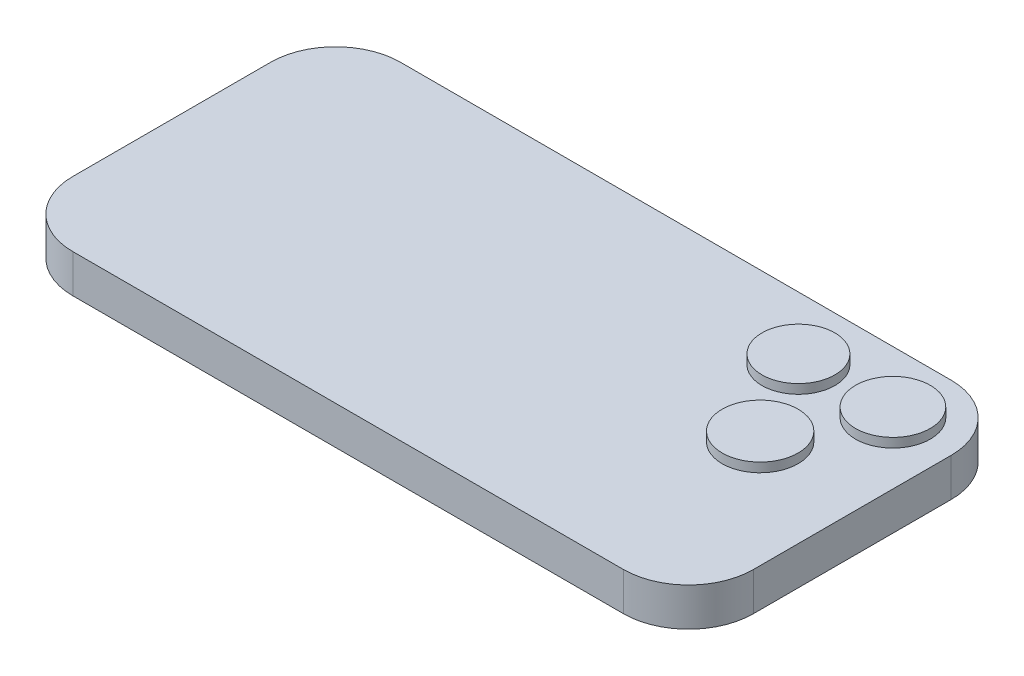
ISO-10303-21;
HEADER;
FILE_DESCRIPTION(('STEP AP214'),'2;1');
FILE_NAME('part.step','',(''),(''),'','','');
FILE_SCHEMA(('AUTOMOTIVE_DESIGN { 1 0 10303 214 1 1 1 1 }'));
ENDSEC;
DATA;
#1=APPLICATION_CONTEXT('core data for automotive mechanical design processes');
#2=APPLICATION_PROTOCOL_DEFINITION('international standard','automotive_design',2000,#1);
#3=PRODUCT_CONTEXT('',#1,'mechanical');
#4=PRODUCT('Part','Part','',(#3));
#5=PRODUCT_RELATED_PRODUCT_CATEGORY('part','',(#4));
#6=PRODUCT_DEFINITION_FORMATION('','',#4);
#7=PRODUCT_DEFINITION_CONTEXT('part definition',#1,'design');
#8=PRODUCT_DEFINITION('design','',#6,#7);
#9=PRODUCT_DEFINITION_SHAPE('','',#8);
#10=(LENGTH_UNIT() NAMED_UNIT(*) SI_UNIT(.MILLI.,.METRE.));
#11=(NAMED_UNIT(*) PLANE_ANGLE_UNIT() SI_UNIT($,.RADIAN.));
#12=(NAMED_UNIT(*) SI_UNIT($,.STERADIAN.) SOLID_ANGLE_UNIT());
#13=UNCERTAINTY_MEASURE_WITH_UNIT(LENGTH_MEASURE(1.E-05),#10,'distance_accuracy_value','');
#14=(GEOMETRIC_REPRESENTATION_CONTEXT(3) GLOBAL_UNCERTAINTY_ASSIGNED_CONTEXT((#13)) GLOBAL_UNIT_ASSIGNED_CONTEXT((#10,
#11,#12)) REPRESENTATION_CONTEXT('',''));
#15=CARTESIAN_POINT('',(0.,0.,0.));
#16=DIRECTION('',(0.,0.,1.));
#17=DIRECTION('',(1.,0.,0.));
#18=AXIS2_PLACEMENT_3D('',#15,#16,#17);
#19=CARTESIAN_POINT('',(-73.3,8.25,35.3));
#20=DIRECTION('',(1.,0.,0.));
#21=DIRECTION('',(0.,0.,-1.));
#22=AXIS2_PLACEMENT_3D('',#19,#20,#21);
#23=PLANE('',#22);
#24=DIRECTION('',(0.,0.,1.));
#25=VECTOR('',#24,1.);
#26=CARTESIAN_POINT('',(-73.3,8.25,35.3));
#27=LINE('',#26,#25);
#28=CARTESIAN_POINT('',(-73.3,8.25,-21.3));
#29=VERTEX_POINT('',#28);
#30=CARTESIAN_POINT('',(-73.3,8.25,21.3));
#31=VERTEX_POINT('',#30);
#32=EDGE_CURVE('E135',#29,#31,#27,.T.);
#33=ORIENTED_EDGE('',*,*,#32,.F.);
#34=DIRECTION('',(0.,-1.,0.));
#35=VECTOR('',#34,1.);
#36=CARTESIAN_POINT('',(-73.3,8.25,-21.3));
#37=LINE('',#36,#35);
#38=CARTESIAN_POINT('',(-73.3,0.,-21.3));
#39=VERTEX_POINT('',#38);
#40=EDGE_CURVE('E11',#29,#39,#37,.T.);
#41=ORIENTED_EDGE('',*,*,#40,.T.);
#42=DIRECTION('',(0.,0.,1.));
#43=VECTOR('',#42,1.);
#44=CARTESIAN_POINT('',(-73.3,0.,35.3));
#45=LINE('',#44,#43);
#46=CARTESIAN_POINT('',(-73.3,0.,21.3));
#47=VERTEX_POINT('',#46);
#48=EDGE_CURVE('E166',#39,#47,#45,.T.);
#49=ORIENTED_EDGE('',*,*,#48,.T.);
#50=DIRECTION('',(0.,-1.,0.));
#51=VECTOR('',#50,1.);
#52=CARTESIAN_POINT('',(-73.3,8.25,21.3));
#53=LINE('',#52,#51);
#54=EDGE_CURVE('E49',#47,#31,#53,.F.);
#55=ORIENTED_EDGE('',*,*,#54,.T.);
#56=EDGE_LOOP('',(#33,#41,#49,#55));
#57=FACE_BOUND('',#56,.T.);
#58=ADVANCED_FACE('F41',(#57),#23,.F.);
#59=CARTESIAN_POINT('',(73.3,8.25,35.3));
#60=DIRECTION('',(0.,0.,-1.));
#61=DIRECTION('',(-1.,0.,0.));
#62=AXIS2_PLACEMENT_3D('',#59,#60,#61);
#63=PLANE('',#62);
#64=DIRECTION('',(1.,0.,0.));
#65=VECTOR('',#64,1.);
#66=CARTESIAN_POINT('',(73.3,0.,35.3));
#67=LINE('',#66,#65);
#68=CARTESIAN_POINT('',(-59.3,0.,35.3));
#69=VERTEX_POINT('',#68);
#70=CARTESIAN_POINT('',(59.3,0.,35.3));
#71=VERTEX_POINT('',#70);
#72=EDGE_CURVE('E140',#69,#71,#67,.T.);
#73=ORIENTED_EDGE('',*,*,#72,.T.);
#74=DIRECTION('',(0.,-1.,0.));
#75=VECTOR('',#74,1.);
#76=CARTESIAN_POINT('',(59.3,8.25,35.3));
#77=LINE('',#76,#75);
#78=CARTESIAN_POINT('',(59.3,8.25,35.3));
#79=VERTEX_POINT('',#78);
#80=EDGE_CURVE('E56',#71,#79,#77,.F.);
#81=ORIENTED_EDGE('',*,*,#80,.T.);
#82=DIRECTION('',(1.,0.,0.));
#83=VECTOR('',#82,1.);
#84=CARTESIAN_POINT('',(73.3,8.25,35.3));
#85=LINE('',#84,#83);
#86=CARTESIAN_POINT('',(-59.3,8.25,35.3));
#87=VERTEX_POINT('',#86);
#88=EDGE_CURVE('E138',#87,#79,#85,.T.);
#89=ORIENTED_EDGE('',*,*,#88,.F.);
#90=DIRECTION('',(0.,-1.,0.));
#91=VECTOR('',#90,1.);
#92=CARTESIAN_POINT('',(-59.3,8.25,35.3));
#93=LINE('',#92,#91);
#94=EDGE_CURVE('E158',#87,#69,#93,.T.);
#95=ORIENTED_EDGE('',*,*,#94,.T.);
#96=EDGE_LOOP('',(#73,#81,#89,#95));
#97=FACE_BOUND('',#96,.T.);
#98=ADVANCED_FACE('F173',(#97),#63,.F.);
#99=CARTESIAN_POINT('',(73.3,8.25,35.3));
#100=DIRECTION('',(-1.,0.,0.));
#101=DIRECTION('',(0.,0.,1.));
#102=AXIS2_PLACEMENT_3D('',#99,#100,#101);
#103=PLANE('',#102);
#104=DIRECTION('',(0.,0.,-1.));
#105=VECTOR('',#104,1.);
#106=CARTESIAN_POINT('',(73.3,0.,35.3));
#107=LINE('',#106,#105);
#108=CARTESIAN_POINT('',(73.3,0.,21.3));
#109=VERTEX_POINT('',#108);
#110=CARTESIAN_POINT('',(73.3,0.,-21.3));
#111=VERTEX_POINT('',#110);
#112=EDGE_CURVE('E136',#109,#111,#107,.T.);
#113=ORIENTED_EDGE('',*,*,#112,.T.);
#114=DIRECTION('',(0.,-1.,0.));
#115=VECTOR('',#114,1.);
#116=CARTESIAN_POINT('',(73.3,8.25,-21.3));
#117=LINE('',#116,#115);
#118=CARTESIAN_POINT('',(73.3,8.25,-21.3));
#119=VERTEX_POINT('',#118);
#120=EDGE_CURVE('E113',#111,#119,#117,.F.);
#121=ORIENTED_EDGE('',*,*,#120,.T.);
#122=DIRECTION('',(0.,0.,-1.));
#123=VECTOR('',#122,1.);
#124=CARTESIAN_POINT('',(73.3,8.25,35.3));
#125=LINE('',#124,#123);
#126=CARTESIAN_POINT('',(73.3,8.25,21.3));
#127=VERTEX_POINT('',#126);
#128=EDGE_CURVE('E178',#127,#119,#125,.T.);
#129=ORIENTED_EDGE('',*,*,#128,.F.);
#130=DIRECTION('',(0.,-1.,0.));
#131=VECTOR('',#130,1.);
#132=CARTESIAN_POINT('',(73.3,8.25,21.3));
#133=LINE('',#132,#131);
#134=EDGE_CURVE('E118',#127,#109,#133,.T.);
#135=ORIENTED_EDGE('',*,*,#134,.T.);
#136=EDGE_LOOP('',(#113,#121,#129,#135));
#137=FACE_BOUND('',#136,.T.);
#138=ADVANCED_FACE('F234',(#137),#103,.F.);
#139=CARTESIAN_POINT('',(73.3,8.25,-35.3));
#140=DIRECTION('',(0.,0.,1.));
#141=DIRECTION('',(1.,0.,0.));
#142=AXIS2_PLACEMENT_3D('',#139,#140,#141);
#143=PLANE('',#142);
#144=DIRECTION('',(-1.,0.,0.));
#145=VECTOR('',#144,1.);
#146=CARTESIAN_POINT('',(73.3,8.25,-35.3));
#147=LINE('',#146,#145);
#148=CARTESIAN_POINT('',(59.3,8.25,-35.3));
#149=VERTEX_POINT('',#148);
#150=CARTESIAN_POINT('',(-59.3,8.25,-35.3));
#151=VERTEX_POINT('',#150);
#152=EDGE_CURVE('E128',#149,#151,#147,.T.);
#153=ORIENTED_EDGE('',*,*,#152,.F.);
#154=DIRECTION('',(0.,-1.,0.));
#155=VECTOR('',#154,1.);
#156=CARTESIAN_POINT('',(59.3,8.25,-35.3));
#157=LINE('',#156,#155);
#158=CARTESIAN_POINT('',(59.3,0.,-35.3));
#159=VERTEX_POINT('',#158);
#160=EDGE_CURVE('E112',#149,#159,#157,.T.);
#161=ORIENTED_EDGE('',*,*,#160,.T.);
#162=DIRECTION('',(-1.,0.,0.));
#163=VECTOR('',#162,1.);
#164=CARTESIAN_POINT('',(73.3,0.,-35.3));
#165=LINE('',#164,#163);
#166=CARTESIAN_POINT('',(-59.3,0.,-35.3));
#167=VERTEX_POINT('',#166);
#168=EDGE_CURVE('E125',#159,#167,#165,.T.);
#169=ORIENTED_EDGE('',*,*,#168,.T.);
#170=DIRECTION('',(0.,-1.,0.));
#171=VECTOR('',#170,1.);
#172=CARTESIAN_POINT('',(-59.3,8.25,-35.3));
#173=LINE('',#172,#171);
#174=EDGE_CURVE('E130',#167,#151,#173,.F.);
#175=ORIENTED_EDGE('',*,*,#174,.T.);
#176=EDGE_LOOP('',(#153,#161,#169,#175));
#177=FACE_BOUND('',#176,.T.);
#178=ADVANCED_FACE('F124',(#177),#143,.F.);
#179=CARTESIAN_POINT('',(0.,8.25,0.));
#180=DIRECTION('',(0.,1.,0.));
#181=DIRECTION('',(0.,0.,1.));
#182=AXIS2_PLACEMENT_3D('',#179,#180,#181);
#183=PLANE('',#182);
#184=CARTESIAN_POINT('',(50.2107638034083,8.25,-3.23733529940573));
#185=DIRECTION('',(0.,1.,0.));
#186=DIRECTION('',(0.,0.,1.));
#187=AXIS2_PLACEMENT_3D('',#184,#185,#186);
#188=CIRCLE('',#187,8.17811363531827);
#189=CARTESIAN_POINT('',(50.2107638034083,8.25,4.94077833591254));
#190=VERTEX_POINT('',#189);
#191=EDGE_CURVE('E193',#190,#190,#188,.T.);
#192=ORIENTED_EDGE('',*,*,#191,.F.);
#193=EDGE_LOOP('',(#192));
#194=FACE_BOUND('',#193,.T.);
#195=CARTESIAN_POINT('',(59.9908504431275,8.25,-22.0502867989051));
#196=DIRECTION('',(0.,1.,0.));
#197=DIRECTION('',(0.,0.,1.));
#198=AXIS2_PLACEMENT_3D('',#195,#196,#197);
#199=CIRCLE('',#198,8.04981965190935);
#200=CARTESIAN_POINT('',(59.9908504431275,8.25,-14.0004671469957));
#201=VERTEX_POINT('',#200);
#202=EDGE_CURVE('E187',#201,#201,#199,.T.);
#203=ORIENTED_EDGE('',*,*,#202,.F.);
#204=EDGE_LOOP('',(#203));
#205=FACE_BOUND('',#204,.T.);
#206=CARTESIAN_POINT('',(39.929810702018,8.25,-21.7600441928197));
#207=DIRECTION('',(0.,1.,0.));
#208=DIRECTION('',(0.,0.,1.));
#209=AXIS2_PLACEMENT_3D('',#206,#207,#208);
#210=CIRCLE('',#209,7.84413539981561);
#211=CARTESIAN_POINT('',(39.929810702018,8.25,-13.9159087930041));
#212=VERTEX_POINT('',#211);
#213=EDGE_CURVE('E181',#212,#212,#210,.T.);
#214=ORIENTED_EDGE('',*,*,#213,.F.);
#215=EDGE_LOOP('',(#214));
#216=FACE_BOUND('',#215,.T.);
#217=ORIENTED_EDGE('',*,*,#128,.T.);
#218=CARTESIAN_POINT('',(59.3,8.25,-21.3));
#219=DIRECTION('',(0.,1.,0.));
#220=DIRECTION('',(0.,0.,1.));
#221=AXIS2_PLACEMENT_3D('',#218,#219,#220);
#222=CIRCLE('',#221,14.);
#223=EDGE_CURVE('E156',#119,#149,#222,.T.);
#224=ORIENTED_EDGE('',*,*,#223,.T.);
#225=ORIENTED_EDGE('',*,*,#152,.T.);
#226=CARTESIAN_POINT('',(-59.3,8.25,-21.3));
#227=DIRECTION('',(0.,1.,0.));
#228=DIRECTION('',(0.,0.,1.));
#229=AXIS2_PLACEMENT_3D('',#226,#227,#228);
#230=CIRCLE('',#229,14.);
#231=EDGE_CURVE('E152',#151,#29,#230,.T.);
#232=ORIENTED_EDGE('',*,*,#231,.T.);
#233=ORIENTED_EDGE('',*,*,#32,.T.);
#234=CARTESIAN_POINT('',(-59.3,8.25,21.3));
#235=DIRECTION('',(0.,1.,0.));
#236=DIRECTION('',(0.,0.,1.));
#237=AXIS2_PLACEMENT_3D('',#234,#235,#236);
#238=CIRCLE('',#237,14.);
#239=EDGE_CURVE('E63',#31,#87,#238,.T.);
#240=ORIENTED_EDGE('',*,*,#239,.T.);
#241=ORIENTED_EDGE('',*,*,#88,.T.);
#242=CARTESIAN_POINT('',(59.3,8.25,21.3));
#243=DIRECTION('',(0.,1.,0.));
#244=DIRECTION('',(0.,0.,1.));
#245=AXIS2_PLACEMENT_3D('',#242,#243,#244);
#246=CIRCLE('',#245,14.);
#247=EDGE_CURVE('E154',#79,#127,#246,.T.);
#248=ORIENTED_EDGE('',*,*,#247,.T.);
#249=EDGE_LOOP('',(#217,#224,#225,#232,#233,#240,#241,#248));
#250=FACE_BOUND('',#249,.T.);
#251=ADVANCED_FACE('F169',(#194,#205,#216,#250),#183,.T.);
#252=CARTESIAN_POINT('',(0.,0.,0.));
#253=DIRECTION('',(0.,1.,0.));
#254=DIRECTION('',(0.,0.,1.));
#255=AXIS2_PLACEMENT_3D('',#252,#253,#254);
#256=PLANE('',#255);
#257=ORIENTED_EDGE('',*,*,#168,.F.);
#258=CARTESIAN_POINT('',(59.3,0.,-21.3));
#259=DIRECTION('',(0.,1.,0.));
#260=DIRECTION('',(0.,0.,1.));
#261=AXIS2_PLACEMENT_3D('',#258,#259,#260);
#262=CIRCLE('',#261,14.);
#263=EDGE_CURVE('E108',#159,#111,#262,.F.);
#264=ORIENTED_EDGE('',*,*,#263,.T.);
#265=ORIENTED_EDGE('',*,*,#112,.F.);
#266=CARTESIAN_POINT('',(59.3,0.,21.3));
#267=DIRECTION('',(0.,1.,0.));
#268=DIRECTION('',(0.,0.,1.));
#269=AXIS2_PLACEMENT_3D('',#266,#267,#268);
#270=CIRCLE('',#269,14.);
#271=EDGE_CURVE('E119',#109,#71,#270,.F.);
#272=ORIENTED_EDGE('',*,*,#271,.T.);
#273=ORIENTED_EDGE('',*,*,#72,.F.);
#274=CARTESIAN_POINT('',(-59.3,0.,21.3));
#275=DIRECTION('',(0.,1.,0.));
#276=DIRECTION('',(0.,0.,1.));
#277=AXIS2_PLACEMENT_3D('',#274,#275,#276);
#278=CIRCLE('',#277,14.);
#279=EDGE_CURVE('E129',#69,#47,#278,.F.);
#280=ORIENTED_EDGE('',*,*,#279,.T.);
#281=ORIENTED_EDGE('',*,*,#48,.F.);
#282=CARTESIAN_POINT('',(-59.3,0.,-21.3));
#283=DIRECTION('',(0.,1.,0.));
#284=DIRECTION('',(0.,0.,1.));
#285=AXIS2_PLACEMENT_3D('',#282,#283,#284);
#286=CIRCLE('',#285,14.);
#287=EDGE_CURVE('E134',#39,#167,#286,.F.);
#288=ORIENTED_EDGE('',*,*,#287,.T.);
#289=EDGE_LOOP('',(#257,#264,#265,#272,#273,#280,#281,#288));
#290=FACE_BOUND('',#289,.T.);
#291=ADVANCED_FACE('F132',(#290),#256,.F.);
#292=CARTESIAN_POINT('',(59.3,8.25,-21.3));
#293=DIRECTION('',(0.,-1.,0.));
#294=DIRECTION('',(0.,0.,-1.));
#295=AXIS2_PLACEMENT_3D('',#292,#293,#294);
#296=CYLINDRICAL_SURFACE('',#295,14.);
#297=ORIENTED_EDGE('',*,*,#223,.F.);
#298=ORIENTED_EDGE('',*,*,#120,.F.);
#299=ORIENTED_EDGE('',*,*,#263,.F.);
#300=ORIENTED_EDGE('',*,*,#160,.F.);
#301=EDGE_LOOP('',(#297,#298,#299,#300));
#302=FACE_BOUND('',#301,.T.);
#303=ADVANCED_FACE('F111',(#302),#296,.T.);
#304=CARTESIAN_POINT('',(59.3,8.25,21.3));
#305=DIRECTION('',(0.,-1.,0.));
#306=DIRECTION('',(0.,0.,-1.));
#307=AXIS2_PLACEMENT_3D('',#304,#305,#306);
#308=CYLINDRICAL_SURFACE('',#307,14.);
#309=ORIENTED_EDGE('',*,*,#247,.F.);
#310=ORIENTED_EDGE('',*,*,#80,.F.);
#311=ORIENTED_EDGE('',*,*,#271,.F.);
#312=ORIENTED_EDGE('',*,*,#134,.F.);
#313=EDGE_LOOP('',(#309,#310,#311,#312));
#314=FACE_BOUND('',#313,.T.);
#315=ADVANCED_FACE('F240',(#314),#308,.T.);
#316=CARTESIAN_POINT('',(-59.3,8.25,-21.3));
#317=DIRECTION('',(0.,-1.,0.));
#318=DIRECTION('',(0.,0.,-1.));
#319=AXIS2_PLACEMENT_3D('',#316,#317,#318);
#320=CYLINDRICAL_SURFACE('',#319,14.);
#321=ORIENTED_EDGE('',*,*,#231,.F.);
#322=ORIENTED_EDGE('',*,*,#174,.F.);
#323=ORIENTED_EDGE('',*,*,#287,.F.);
#324=ORIENTED_EDGE('',*,*,#40,.F.);
#325=EDGE_LOOP('',(#321,#322,#323,#324));
#326=FACE_BOUND('',#325,.T.);
#327=ADVANCED_FACE('F227',(#326),#320,.T.);
#328=CARTESIAN_POINT('',(-59.3,8.25,21.3));
#329=DIRECTION('',(0.,-1.,0.));
#330=DIRECTION('',(0.,0.,-1.));
#331=AXIS2_PLACEMENT_3D('',#328,#329,#330);
#332=CYLINDRICAL_SURFACE('',#331,14.);
#333=ORIENTED_EDGE('',*,*,#239,.F.);
#334=ORIENTED_EDGE('',*,*,#54,.F.);
#335=ORIENTED_EDGE('',*,*,#279,.F.);
#336=ORIENTED_EDGE('',*,*,#94,.F.);
#337=EDGE_LOOP('',(#333,#334,#335,#336));
#338=FACE_BOUND('',#337,.T.);
#339=ADVANCED_FACE('F43',(#338),#332,.T.);
#340=CARTESIAN_POINT('',(39.929810702018,10.25,-21.7600441928197));
#341=DIRECTION('',(0.,-1.,0.));
#342=DIRECTION('',(0.,0.,-1.));
#343=AXIS2_PLACEMENT_3D('',#340,#341,#342);
#344=CYLINDRICAL_SURFACE('',#343,7.84413539981561);
#345=CARTESIAN_POINT('',(39.929810702018,10.25,-21.7600441928197));
#346=DIRECTION('',(0.,1.,0.));
#347=DIRECTION('',(0.,0.,1.));
#348=AXIS2_PLACEMENT_3D('',#345,#346,#347);
#349=CIRCLE('',#348,7.84413539981561);
#350=CARTESIAN_POINT('',(39.929810702018,10.25,-13.9159087930041));
#351=VERTEX_POINT('',#350);
#352=EDGE_CURVE('E174',#351,#351,#349,.T.);
#353=ORIENTED_EDGE('',*,*,#352,.F.);
#354=EDGE_LOOP('',(#353));
#355=FACE_BOUND('',#354,.T.);
#356=ORIENTED_EDGE('',*,*,#213,.T.);
#357=EDGE_LOOP('',(#356));
#358=FACE_BOUND('',#357,.T.);
#359=ADVANCED_FACE('F215',(#355,#358),#344,.T.);
#360=CARTESIAN_POINT('',(0.,10.25,0.));
#361=DIRECTION('',(0.,1.,0.));
#362=DIRECTION('',(0.,0.,1.));
#363=AXIS2_PLACEMENT_3D('',#360,#361,#362);
#364=PLANE('',#363);
#365=ORIENTED_EDGE('',*,*,#352,.T.);
#366=EDGE_LOOP('',(#365));
#367=FACE_BOUND('',#366,.T.);
#368=ADVANCED_FACE('F217',(#367),#364,.T.);
#369=CARTESIAN_POINT('',(59.9908504431275,10.25,-22.0502867989051));
#370=DIRECTION('',(0.,-1.,0.));
#371=DIRECTION('',(0.,0.,-1.));
#372=AXIS2_PLACEMENT_3D('',#369,#370,#371);
#373=CYLINDRICAL_SURFACE('',#372,8.04981965190935);
#374=CARTESIAN_POINT('',(59.9908504431275,10.25,-22.0502867989051));
#375=DIRECTION('',(0.,1.,0.));
#376=DIRECTION('',(0.,0.,1.));
#377=AXIS2_PLACEMENT_3D('',#374,#375,#376);
#378=CIRCLE('',#377,8.04981965190935);
#379=CARTESIAN_POINT('',(59.9908504431275,10.25,-14.0004671469957));
#380=VERTEX_POINT('',#379);
#381=EDGE_CURVE('E184',#380,#380,#378,.T.);
#382=ORIENTED_EDGE('',*,*,#381,.F.);
#383=EDGE_LOOP('',(#382));
#384=FACE_BOUND('',#383,.T.);
#385=ORIENTED_EDGE('',*,*,#202,.T.);
#386=EDGE_LOOP('',(#385));
#387=FACE_BOUND('',#386,.T.);
#388=ADVANCED_FACE('F224',(#384,#387),#373,.T.);
#389=CARTESIAN_POINT('',(0.,10.25,0.));
#390=DIRECTION('',(0.,1.,0.));
#391=DIRECTION('',(0.,0.,1.));
#392=AXIS2_PLACEMENT_3D('',#389,#390,#391);
#393=PLANE('',#392);
#394=ORIENTED_EDGE('',*,*,#381,.T.);
#395=EDGE_LOOP('',(#394));
#396=FACE_BOUND('',#395,.T.);
#397=ADVANCED_FACE('F204',(#396),#393,.T.);
#398=CARTESIAN_POINT('',(50.2107638034083,10.25,-3.23733529940573));
#399=DIRECTION('',(0.,-1.,0.));
#400=DIRECTION('',(0.,0.,-1.));
#401=AXIS2_PLACEMENT_3D('',#398,#399,#400);
#402=CYLINDRICAL_SURFACE('',#401,8.17811363531827);
#403=CARTESIAN_POINT('',(50.2107638034083,10.25,-3.23733529940573));
#404=DIRECTION('',(0.,1.,0.));
#405=DIRECTION('',(0.,0.,1.));
#406=AXIS2_PLACEMENT_3D('',#403,#404,#405);
#407=CIRCLE('',#406,8.17811363531827);
#408=CARTESIAN_POINT('',(50.2107638034083,10.25,4.94077833591254));
#409=VERTEX_POINT('',#408);
#410=EDGE_CURVE('E190',#409,#409,#407,.T.);
#411=ORIENTED_EDGE('',*,*,#410,.F.);
#412=EDGE_LOOP('',(#411));
#413=FACE_BOUND('',#412,.T.);
#414=ORIENTED_EDGE('',*,*,#191,.T.);
#415=EDGE_LOOP('',(#414));
#416=FACE_BOUND('',#415,.T.);
#417=ADVANCED_FACE('F201',(#413,#416),#402,.T.);
#418=CARTESIAN_POINT('',(0.,10.25,0.));
#419=DIRECTION('',(0.,1.,0.));
#420=DIRECTION('',(0.,0.,1.));
#421=AXIS2_PLACEMENT_3D('',#418,#419,#420);
#422=PLANE('',#421);
#423=ORIENTED_EDGE('',*,*,#410,.T.);
#424=EDGE_LOOP('',(#423));
#425=FACE_BOUND('',#424,.T.);
#426=ADVANCED_FACE('F199',(#425),#422,.T.);
#427=CLOSED_SHELL('',(#58,#98,#138,#178,#251,#291,#303,#315,#327,#339,#359,#368,#388,#397,#417,#426));
#428=MANIFOLD_SOLID_BREP('B2',#427);
#429=ADVANCED_BREP_SHAPE_REPRESENTATION('',(#18,#428),#14);
#430=SHAPE_DEFINITION_REPRESENTATION(#9,#429);
ENDSEC;
END-ISO-10303-21;
